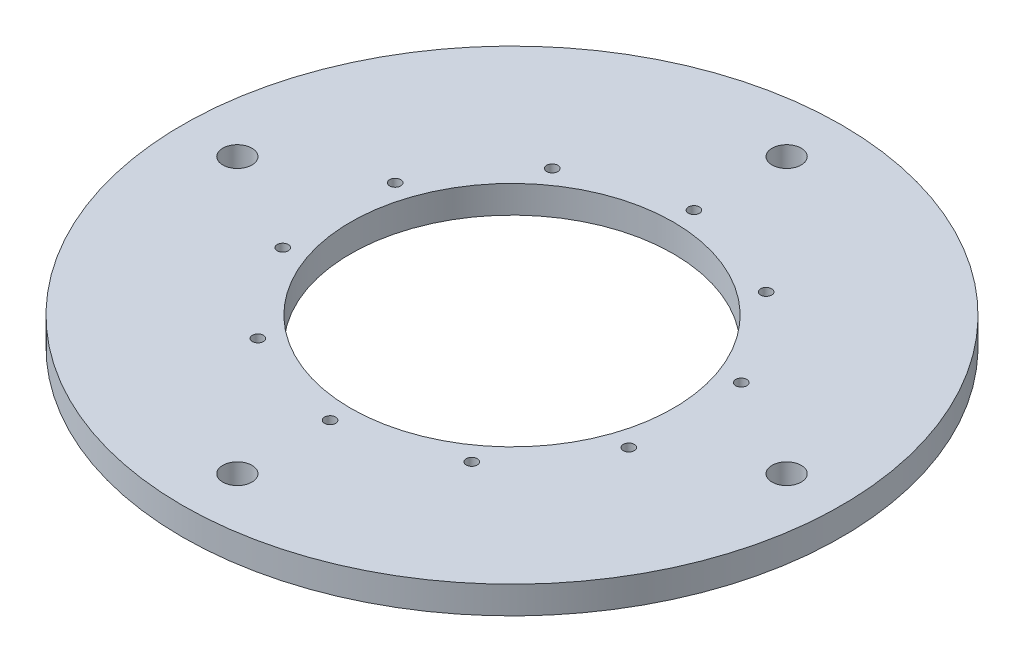
ISO-10303-21;
HEADER;
FILE_DESCRIPTION(('STEP AP214'),'2;1');
FILE_NAME('part.step','',(''),(''),'','','');
FILE_SCHEMA(('AUTOMOTIVE_DESIGN { 1 0 10303 214 1 1 1 1 }'));
ENDSEC;
DATA;
#1=APPLICATION_CONTEXT('core data for automotive mechanical design processes');
#2=APPLICATION_PROTOCOL_DEFINITION('international standard','automotive_design',2000,#1);
#3=PRODUCT_CONTEXT('',#1,'mechanical');
#4=PRODUCT('Part','Part','',(#3));
#5=PRODUCT_RELATED_PRODUCT_CATEGORY('part','',(#4));
#6=PRODUCT_DEFINITION_FORMATION('','',#4);
#7=PRODUCT_DEFINITION_CONTEXT('part definition',#1,'design');
#8=PRODUCT_DEFINITION('design','',#6,#7);
#9=PRODUCT_DEFINITION_SHAPE('','',#8);
#10=(LENGTH_UNIT() NAMED_UNIT(*) SI_UNIT(.MILLI.,.METRE.));
#11=(NAMED_UNIT(*) PLANE_ANGLE_UNIT() SI_UNIT($,.RADIAN.));
#12=(NAMED_UNIT(*) SI_UNIT($,.STERADIAN.) SOLID_ANGLE_UNIT());
#13=UNCERTAINTY_MEASURE_WITH_UNIT(LENGTH_MEASURE(1.E-05),#10,'distance_accuracy_value','');
#14=(GEOMETRIC_REPRESENTATION_CONTEXT(3) GLOBAL_UNCERTAINTY_ASSIGNED_CONTEXT((#13)) GLOBAL_UNIT_ASSIGNED_CONTEXT((#10,
#11,#12)) REPRESENTATION_CONTEXT('',''));
#15=CARTESIAN_POINT('',(0.,0.,0.));
#16=DIRECTION('',(0.,0.,1.));
#17=DIRECTION('',(1.,0.,0.));
#18=AXIS2_PLACEMENT_3D('',#15,#16,#17);
#19=CARTESIAN_POINT('',(0.,-12.7,0.));
#20=DIRECTION('',(0.,1.,0.));
#21=DIRECTION('',(0.,0.,1.));
#22=AXIS2_PLACEMENT_3D('',#19,#20,#21);
#23=CYLINDRICAL_SURFACE('',#22,74.6125);
#24=CARTESIAN_POINT('',(0.,-12.7,0.));
#25=DIRECTION('',(0.,1.,0.));
#26=DIRECTION('',(0.,0.,1.));
#27=AXIS2_PLACEMENT_3D('',#24,#25,#26);
#28=CIRCLE('',#27,74.6125);
#29=CARTESIAN_POINT('',(0.,-12.7,74.6125));
#30=VERTEX_POINT('',#29);
#31=EDGE_CURVE('E48',#30,#30,#28,.T.);
#32=ORIENTED_EDGE('',*,*,#31,.F.);
#33=EDGE_LOOP('',(#32));
#34=FACE_BOUND('',#33,.T.);
#35=CARTESIAN_POINT('',(0.,0.,0.));
#36=DIRECTION('',(0.,1.,0.));
#37=DIRECTION('',(0.,0.,1.));
#38=AXIS2_PLACEMENT_3D('',#35,#36,#37);
#39=CIRCLE('',#38,74.6125);
#40=CARTESIAN_POINT('',(0.,0.,74.6125));
#41=VERTEX_POINT('',#40);
#42=EDGE_CURVE('E55',#41,#41,#39,.T.);
#43=ORIENTED_EDGE('',*,*,#42,.T.);
#44=EDGE_LOOP('',(#43));
#45=FACE_BOUND('',#44,.T.);
#46=ADVANCED_FACE('F41',(#34,#45),#23,.F.);
#47=CARTESIAN_POINT('',(0.,-12.7,0.));
#48=DIRECTION('',(0.,1.,0.));
#49=DIRECTION('',(0.,0.,1.));
#50=AXIS2_PLACEMENT_3D('',#47,#48,#49);
#51=CYLINDRICAL_SURFACE('',#50,152.4);
#52=CARTESIAN_POINT('',(0.,-12.7,0.));
#53=DIRECTION('',(0.,1.,0.));
#54=DIRECTION('',(0.,0.,1.));
#55=AXIS2_PLACEMENT_3D('',#52,#53,#54);
#56=CIRCLE('',#55,152.4);
#57=CARTESIAN_POINT('',(0.,-12.7,152.4));
#58=VERTEX_POINT('',#57);
#59=EDGE_CURVE('E10',#58,#58,#56,.T.);
#60=ORIENTED_EDGE('',*,*,#59,.T.);
#61=EDGE_LOOP('',(#60));
#62=FACE_BOUND('',#61,.T.);
#63=CARTESIAN_POINT('',(0.,0.,0.));
#64=DIRECTION('',(0.,1.,0.));
#65=DIRECTION('',(0.,0.,1.));
#66=AXIS2_PLACEMENT_3D('',#63,#64,#65);
#67=CIRCLE('',#66,152.4);
#68=CARTESIAN_POINT('',(0.,0.,152.4));
#69=VERTEX_POINT('',#68);
#70=EDGE_CURVE('E44',#69,#69,#67,.T.);
#71=ORIENTED_EDGE('',*,*,#70,.F.);
#72=EDGE_LOOP('',(#71));
#73=FACE_BOUND('',#72,.T.);
#74=ADVANCED_FACE('F179',(#62,#73),#51,.T.);
#75=CARTESIAN_POINT('',(0.,-12.7,0.));
#76=DIRECTION('',(0.,1.,0.));
#77=DIRECTION('',(0.,0.,1.));
#78=AXIS2_PLACEMENT_3D('',#75,#76,#77);
#79=PLANE('',#78);
#80=CARTESIAN_POINT('',(-49.4547816647571,-12.7,-68.0686673642228));
#81=DIRECTION('',(0.,1.,0.));
#82=DIRECTION('',(0.587785252292462,0.,0.809016994374955));
#83=AXIS2_PLACEMENT_3D('',#80,#81,#82);
#84=CIRCLE('',#83,2.5527);
#85=CARTESIAN_POINT('',(-47.9543422512301,-12.7,-66.0034896826818));
#86=VERTEX_POINT('',#85);
#87=EDGE_CURVE('E103',#86,#86,#84,.T.);
#88=ORIENTED_EDGE('',*,*,#87,.T.);
#89=EDGE_LOOP('',(#88));
#90=FACE_BOUND('',#89,.T.);
#91=CARTESIAN_POINT('',(-80.0195176397832,-12.7,-25.999917364223));
#92=DIRECTION('',(0.,1.,0.));
#93=DIRECTION('',(0.95105651629515,0.,0.309016994374958));
#94=AXIS2_PLACEMENT_3D('',#91,#92,#93);
#95=CIRCLE('',#94,2.5527);
#96=CARTESIAN_POINT('',(-77.5917556706366,-12.7,-25.2110896826821));
#97=VERTEX_POINT('',#96);
#98=EDGE_CURVE('E102',#97,#97,#95,.T.);
#99=ORIENTED_EDGE('',*,*,#98,.T.);
#100=EDGE_LOOP('',(#99));
#101=FACE_BOUND('',#100,.T.);
#102=CARTESIAN_POINT('',(-80.0195176397837,-12.7,25.9999173642214));
#103=DIRECTION('',(0.,1.,0.));
#104=DIRECTION('',(0.951056516295157,0.,-0.309016994374938));
#105=AXIS2_PLACEMENT_3D('',#102,#103,#104);
#106=CIRCLE('',#105,2.5527);
#107=CARTESIAN_POINT('',(-77.5917556706371,-12.7,25.2110896826805));
#108=VERTEX_POINT('',#107);
#109=EDGE_CURVE('E109',#108,#108,#106,.T.);
#110=ORIENTED_EDGE('',*,*,#109,.T.);
#111=EDGE_LOOP('',(#110));
#112=FACE_BOUND('',#111,.T.);
#113=CARTESIAN_POINT('',(-49.4547816647586,-12.7,68.0686673642217));
#114=DIRECTION('',(0.,1.,0.));
#115=DIRECTION('',(0.58778525229248,0.,-0.809016994374942));
#116=AXIS2_PLACEMENT_3D('',#113,#114,#115);
#117=CIRCLE('',#116,2.5527);
#118=CARTESIAN_POINT('',(-47.9543422512315,-12.7,66.0034896826808));
#119=VERTEX_POINT('',#118);
#120=EDGE_CURVE('E115',#119,#119,#117,.T.);
#121=ORIENTED_EDGE('',*,*,#120,.T.);
#122=EDGE_LOOP('',(#121));
#123=FACE_BOUND('',#122,.T.);
#124=CARTESIAN_POINT('',(0.,-12.7,84.1375));
#125=DIRECTION('',(0.,1.,0.));
#126=DIRECTION('',(0.,0.,-1.));
#127=AXIS2_PLACEMENT_3D('',#124,#125,#126);
#128=CIRCLE('',#127,2.5527);
#129=CARTESIAN_POINT('',(0.,-12.7,81.5848));
#130=VERTEX_POINT('',#129);
#131=EDGE_CURVE('E121',#130,#130,#128,.T.);
#132=ORIENTED_EDGE('',*,*,#131,.T.);
#133=EDGE_LOOP('',(#132));
#134=FACE_BOUND('',#133,.T.);
#135=CARTESIAN_POINT('',(49.4547816647576,-12.7,68.0686673642224));
#136=DIRECTION('',(0.,1.,0.));
#137=DIRECTION('',(-0.587785252292469,0.,-0.809016994374951));
#138=AXIS2_PLACEMENT_3D('',#135,#136,#137);
#139=CIRCLE('',#138,2.5527);
#140=CARTESIAN_POINT('',(47.9543422512306,-12.7,66.0034896826815));
#141=VERTEX_POINT('',#140);
#142=EDGE_CURVE('E127',#141,#141,#139,.T.);
#143=ORIENTED_EDGE('',*,*,#142,.T.);
#144=EDGE_LOOP('',(#143));
#145=FACE_BOUND('',#144,.T.);
#146=CARTESIAN_POINT('',(80.0195176397834,-12.7,25.9999173642225));
#147=DIRECTION('',(0.,1.,0.));
#148=DIRECTION('',(-0.951056516295152,0.,-0.309016994374952));
#149=AXIS2_PLACEMENT_3D('',#146,#147,#148);
#150=CIRCLE('',#149,2.5527);
#151=CARTESIAN_POINT('',(77.5917556706368,-12.7,25.2110896826816));
#152=VERTEX_POINT('',#151);
#153=EDGE_CURVE('E133',#152,#152,#150,.T.);
#154=ORIENTED_EDGE('',*,*,#153,.T.);
#155=EDGE_LOOP('',(#154));
#156=FACE_BOUND('',#155,.T.);
#157=CARTESIAN_POINT('',(80.0195176397836,-12.7,-25.9999173642219));
#158=DIRECTION('',(0.,1.,0.));
#159=DIRECTION('',(-0.951056516295155,0.,0.309016994374945));
#160=AXIS2_PLACEMENT_3D('',#157,#158,#159);
#161=CIRCLE('',#160,2.5527);
#162=CARTESIAN_POINT('',(77.5917556706369,-12.7,-25.211089682681));
#163=VERTEX_POINT('',#162);
#164=EDGE_CURVE('E139',#163,#163,#161,.T.);
#165=ORIENTED_EDGE('',*,*,#164,.T.);
#166=EDGE_LOOP('',(#165));
#167=FACE_BOUND('',#166,.T.);
#168=CARTESIAN_POINT('',(49.4547816647581,-12.7,-68.0686673642221));
#169=DIRECTION('',(0.,1.,0.));
#170=DIRECTION('',(-0.587785252292474,0.,0.809016994374947));
#171=AXIS2_PLACEMENT_3D('',#168,#169,#170);
#172=CIRCLE('',#171,2.5527);
#173=CARTESIAN_POINT('',(47.9543422512311,-12.7,-66.0034896826812));
#174=VERTEX_POINT('',#173);
#175=EDGE_CURVE('E95',#174,#174,#172,.T.);
#176=ORIENTED_EDGE('',*,*,#175,.T.);
#177=EDGE_LOOP('',(#176));
#178=FACE_BOUND('',#177,.T.);
#179=CARTESIAN_POINT('',(0.,-12.7,-84.1375));
#180=DIRECTION('',(0.,1.,0.));
#181=DIRECTION('',(0.,0.,1.));
#182=AXIS2_PLACEMENT_3D('',#179,#180,#181);
#183=CIRCLE('',#182,2.5527);
#184=CARTESIAN_POINT('',(0.,-12.7,-81.5848));
#185=VERTEX_POINT('',#184);
#186=EDGE_CURVE('E76',#185,#185,#183,.T.);
#187=ORIENTED_EDGE('',*,*,#186,.T.);
#188=EDGE_LOOP('',(#187));
#189=FACE_BOUND('',#188,.T.);
#190=CARTESIAN_POINT('',(127.,-12.7,4.43418130033078E-13));
#191=DIRECTION('',(0.,1.,0.));
#192=DIRECTION('',(-1.,0.,0.));
#193=AXIS2_PLACEMENT_3D('',#190,#191,#192);
#194=CIRCLE('',#193,6.74624);
#195=CARTESIAN_POINT('',(120.25376,-12.7,4.19863758965721E-13));
#196=VERTEX_POINT('',#195);
#197=EDGE_CURVE('E80',#196,#196,#194,.T.);
#198=ORIENTED_EDGE('',*,*,#197,.T.);
#199=EDGE_LOOP('',(#198));
#200=FACE_BOUND('',#199,.T.);
#201=CARTESIAN_POINT('',(0.,-12.7,127.));
#202=DIRECTION('',(0.,1.,0.));
#203=DIRECTION('',(0.,0.,-1.));
#204=AXIS2_PLACEMENT_3D('',#201,#202,#203);
#205=CIRCLE('',#204,6.74624);
#206=CARTESIAN_POINT('',(0.,-12.7,120.25376));
#207=VERTEX_POINT('',#206);
#208=EDGE_CURVE('E72',#207,#207,#205,.T.);
#209=ORIENTED_EDGE('',*,*,#208,.T.);
#210=EDGE_LOOP('',(#209));
#211=FACE_BOUND('',#210,.T.);
#212=CARTESIAN_POINT('',(-127.,-12.7,-1.33025439009923E-12));
#213=DIRECTION('',(0.,1.,0.));
#214=DIRECTION('',(1.,0.,0.));
#215=AXIS2_PLACEMENT_3D('',#212,#213,#214);
#216=CIRCLE('',#215,6.74624);
#217=CARTESIAN_POINT('',(-120.25376,-12.7,-1.25959127689716E-12));
#218=VERTEX_POINT('',#217);
#219=EDGE_CURVE('E73',#218,#218,#216,.T.);
#220=ORIENTED_EDGE('',*,*,#219,.T.);
#221=EDGE_LOOP('',(#220));
#222=FACE_BOUND('',#221,.T.);
#223=CARTESIAN_POINT('',(0.,-12.7,-127.));
#224=DIRECTION('',(0.,1.,0.));
#225=DIRECTION('',(0.,0.,1.));
#226=AXIS2_PLACEMENT_3D('',#223,#224,#225);
#227=CIRCLE('',#226,6.74624);
#228=CARTESIAN_POINT('',(0.,-12.7,-120.25376));
#229=VERTEX_POINT('',#228);
#230=EDGE_CURVE('E57',#229,#229,#227,.T.);
#231=ORIENTED_EDGE('',*,*,#230,.T.);
#232=EDGE_LOOP('',(#231));
#233=FACE_BOUND('',#232,.T.);
#234=ORIENTED_EDGE('',*,*,#31,.T.);
#235=EDGE_LOOP('',(#234));
#236=FACE_BOUND('',#235,.T.);
#237=ORIENTED_EDGE('',*,*,#59,.F.);
#238=EDGE_LOOP('',(#237));
#239=FACE_BOUND('',#238,.T.);
#240=ADVANCED_FACE('F147',(#90,#101,#112,#123,#134,#145,#156,#167,#178,#189,#200,#211,#222,#233,
#236,#239),#79,.F.);
#241=CARTESIAN_POINT('',(0.,0.,0.));
#242=DIRECTION('',(0.,1.,0.));
#243=DIRECTION('',(0.,0.,1.));
#244=AXIS2_PLACEMENT_3D('',#241,#242,#243);
#245=PLANE('',#244);
#246=CARTESIAN_POINT('',(-49.4547816647571,0.,-68.0686673642228));
#247=DIRECTION('',(0.,1.,0.));
#248=DIRECTION('',(0.587785252292462,0.,0.809016994374955));
#249=AXIS2_PLACEMENT_3D('',#246,#247,#248);
#250=CIRCLE('',#249,2.5527);
#251=CARTESIAN_POINT('',(-47.9543422512301,0.,-66.0034896826818));
#252=VERTEX_POINT('',#251);
#253=EDGE_CURVE('E99',#252,#252,#250,.T.);
#254=ORIENTED_EDGE('',*,*,#253,.F.);
#255=EDGE_LOOP('',(#254));
#256=FACE_BOUND('',#255,.T.);
#257=CARTESIAN_POINT('',(-80.0195176397832,0.,-25.999917364223));
#258=DIRECTION('',(0.,1.,0.));
#259=DIRECTION('',(0.95105651629515,0.,0.309016994374958));
#260=AXIS2_PLACEMENT_3D('',#257,#258,#259);
#261=CIRCLE('',#260,2.5527);
#262=CARTESIAN_POINT('',(-77.5917556706366,0.,-25.2110896826821));
#263=VERTEX_POINT('',#262);
#264=EDGE_CURVE('E106',#263,#263,#261,.T.);
#265=ORIENTED_EDGE('',*,*,#264,.F.);
#266=EDGE_LOOP('',(#265));
#267=FACE_BOUND('',#266,.T.);
#268=CARTESIAN_POINT('',(-80.0195176397837,0.,25.9999173642214));
#269=DIRECTION('',(0.,1.,0.));
#270=DIRECTION('',(0.951056516295157,0.,-0.309016994374938));
#271=AXIS2_PLACEMENT_3D('',#268,#269,#270);
#272=CIRCLE('',#271,2.5527);
#273=CARTESIAN_POINT('',(-77.5917556706371,0.,25.2110896826805));
#274=VERTEX_POINT('',#273);
#275=EDGE_CURVE('E112',#274,#274,#272,.T.);
#276=ORIENTED_EDGE('',*,*,#275,.F.);
#277=EDGE_LOOP('',(#276));
#278=FACE_BOUND('',#277,.T.);
#279=CARTESIAN_POINT('',(-49.4547816647586,0.,68.0686673642217));
#280=DIRECTION('',(0.,1.,0.));
#281=DIRECTION('',(0.58778525229248,0.,-0.809016994374942));
#282=AXIS2_PLACEMENT_3D('',#279,#280,#281);
#283=CIRCLE('',#282,2.5527);
#284=CARTESIAN_POINT('',(-47.9543422512315,0.,66.0034896826808));
#285=VERTEX_POINT('',#284);
#286=EDGE_CURVE('E118',#285,#285,#283,.T.);
#287=ORIENTED_EDGE('',*,*,#286,.F.);
#288=EDGE_LOOP('',(#287));
#289=FACE_BOUND('',#288,.T.);
#290=CARTESIAN_POINT('',(0.,0.,84.1375));
#291=DIRECTION('',(0.,1.,0.));
#292=DIRECTION('',(0.,0.,-1.));
#293=AXIS2_PLACEMENT_3D('',#290,#291,#292);
#294=CIRCLE('',#293,2.5527);
#295=CARTESIAN_POINT('',(0.,0.,81.5848));
#296=VERTEX_POINT('',#295);
#297=EDGE_CURVE('E124',#296,#296,#294,.T.);
#298=ORIENTED_EDGE('',*,*,#297,.F.);
#299=EDGE_LOOP('',(#298));
#300=FACE_BOUND('',#299,.T.);
#301=CARTESIAN_POINT('',(49.4547816647576,0.,68.0686673642224));
#302=DIRECTION('',(0.,1.,0.));
#303=DIRECTION('',(-0.587785252292469,0.,-0.809016994374951));
#304=AXIS2_PLACEMENT_3D('',#301,#302,#303);
#305=CIRCLE('',#304,2.5527);
#306=CARTESIAN_POINT('',(47.9543422512306,0.,66.0034896826815));
#307=VERTEX_POINT('',#306);
#308=EDGE_CURVE('E130',#307,#307,#305,.T.);
#309=ORIENTED_EDGE('',*,*,#308,.F.);
#310=EDGE_LOOP('',(#309));
#311=FACE_BOUND('',#310,.T.);
#312=CARTESIAN_POINT('',(80.0195176397834,0.,25.9999173642225));
#313=DIRECTION('',(0.,1.,0.));
#314=DIRECTION('',(-0.951056516295152,0.,-0.309016994374952));
#315=AXIS2_PLACEMENT_3D('',#312,#313,#314);
#316=CIRCLE('',#315,2.5527);
#317=CARTESIAN_POINT('',(77.5917556706368,0.,25.2110896826816));
#318=VERTEX_POINT('',#317);
#319=EDGE_CURVE('E136',#318,#318,#316,.T.);
#320=ORIENTED_EDGE('',*,*,#319,.F.);
#321=EDGE_LOOP('',(#320));
#322=FACE_BOUND('',#321,.T.);
#323=CARTESIAN_POINT('',(80.0195176397836,0.,-25.9999173642219));
#324=DIRECTION('',(0.,1.,0.));
#325=DIRECTION('',(-0.951056516295155,0.,0.309016994374945));
#326=AXIS2_PLACEMENT_3D('',#323,#324,#325);
#327=CIRCLE('',#326,2.5527);
#328=CARTESIAN_POINT('',(77.5917556706369,0.,-25.211089682681));
#329=VERTEX_POINT('',#328);
#330=EDGE_CURVE('E98',#329,#329,#327,.T.);
#331=ORIENTED_EDGE('',*,*,#330,.F.);
#332=EDGE_LOOP('',(#331));
#333=FACE_BOUND('',#332,.T.);
#334=CARTESIAN_POINT('',(49.4547816647581,0.,-68.0686673642221));
#335=DIRECTION('',(0.,1.,0.));
#336=DIRECTION('',(-0.587785252292474,0.,0.809016994374947));
#337=AXIS2_PLACEMENT_3D('',#334,#335,#336);
#338=CIRCLE('',#337,2.5527);
#339=CARTESIAN_POINT('',(47.9543422512311,0.,-66.0034896826812));
#340=VERTEX_POINT('',#339);
#341=EDGE_CURVE('E92',#340,#340,#338,.T.);
#342=ORIENTED_EDGE('',*,*,#341,.F.);
#343=EDGE_LOOP('',(#342));
#344=FACE_BOUND('',#343,.T.);
#345=CARTESIAN_POINT('',(0.,0.,-84.1375));
#346=DIRECTION('',(0.,1.,0.));
#347=DIRECTION('',(0.,0.,1.));
#348=AXIS2_PLACEMENT_3D('',#345,#346,#347);
#349=CIRCLE('',#348,2.5527);
#350=CARTESIAN_POINT('',(0.,0.,-81.5848));
#351=VERTEX_POINT('',#350);
#352=EDGE_CURVE('E89',#351,#351,#349,.T.);
#353=ORIENTED_EDGE('',*,*,#352,.F.);
#354=EDGE_LOOP('',(#353));
#355=FACE_BOUND('',#354,.T.);
#356=CARTESIAN_POINT('',(127.,0.,4.43418130033078E-13));
#357=DIRECTION('',(0.,1.,0.));
#358=DIRECTION('',(-1.,0.,0.));
#359=AXIS2_PLACEMENT_3D('',#356,#357,#358);
#360=CIRCLE('',#359,6.74624);
#361=CARTESIAN_POINT('',(120.25376,0.,4.19863758965721E-13));
#362=VERTEX_POINT('',#361);
#363=EDGE_CURVE('E66',#362,#362,#360,.T.);
#364=ORIENTED_EDGE('',*,*,#363,.F.);
#365=EDGE_LOOP('',(#364));
#366=FACE_BOUND('',#365,.T.);
#367=CARTESIAN_POINT('',(0.,0.,127.));
#368=DIRECTION('',(0.,1.,0.));
#369=DIRECTION('',(0.,0.,-1.));
#370=AXIS2_PLACEMENT_3D('',#367,#368,#369);
#371=CIRCLE('',#370,6.74624);
#372=CARTESIAN_POINT('',(0.,0.,120.25376));
#373=VERTEX_POINT('',#372);
#374=EDGE_CURVE('E77',#373,#373,#371,.T.);
#375=ORIENTED_EDGE('',*,*,#374,.F.);
#376=EDGE_LOOP('',(#375));
#377=FACE_BOUND('',#376,.T.);
#378=CARTESIAN_POINT('',(-127.,0.,-1.33025439009923E-12));
#379=DIRECTION('',(0.,1.,0.));
#380=DIRECTION('',(1.,0.,0.));
#381=AXIS2_PLACEMENT_3D('',#378,#379,#380);
#382=CIRCLE('',#381,6.74624);
#383=CARTESIAN_POINT('',(-120.25376,0.,-1.25959127689716E-12));
#384=VERTEX_POINT('',#383);
#385=EDGE_CURVE('E69',#384,#384,#382,.T.);
#386=ORIENTED_EDGE('',*,*,#385,.F.);
#387=EDGE_LOOP('',(#386));
#388=FACE_BOUND('',#387,.T.);
#389=CARTESIAN_POINT('',(0.,0.,-127.));
#390=DIRECTION('',(0.,1.,0.));
#391=DIRECTION('',(0.,0.,1.));
#392=AXIS2_PLACEMENT_3D('',#389,#390,#391);
#393=CIRCLE('',#392,6.74624);
#394=CARTESIAN_POINT('',(0.,0.,-120.25376));
#395=VERTEX_POINT('',#394);
#396=EDGE_CURVE('E62',#395,#395,#393,.T.);
#397=ORIENTED_EDGE('',*,*,#396,.F.);
#398=EDGE_LOOP('',(#397));
#399=FACE_BOUND('',#398,.T.);
#400=ORIENTED_EDGE('',*,*,#42,.F.);
#401=EDGE_LOOP('',(#400));
#402=FACE_BOUND('',#401,.T.);
#403=ORIENTED_EDGE('',*,*,#70,.T.);
#404=EDGE_LOOP('',(#403));
#405=FACE_BOUND('',#404,.T.);
#406=ADVANCED_FACE('F158',(#256,#267,#278,#289,#300,#311,#322,#333,#344,#355,#366,#377,#388,
#399,#402,#405),#245,.T.);
#407=CARTESIAN_POINT('',(0.,0.,-127.));
#408=DIRECTION('',(0.,1.,0.));
#409=DIRECTION('',(0.,0.,1.));
#410=AXIS2_PLACEMENT_3D('',#407,#408,#409);
#411=CYLINDRICAL_SURFACE('',#410,6.74624);
#412=ORIENTED_EDGE('',*,*,#230,.F.);
#413=EDGE_LOOP('',(#412));
#414=FACE_BOUND('',#413,.T.);
#415=ORIENTED_EDGE('',*,*,#396,.T.);
#416=EDGE_LOOP('',(#415));
#417=FACE_BOUND('',#416,.T.);
#418=ADVANCED_FACE('F161',(#414,#417),#411,.F.);
#419=CARTESIAN_POINT('',(-127.,0.,-1.33025439009923E-12));
#420=DIRECTION('',(0.,1.,0.));
#421=DIRECTION('',(1.,0.,0.));
#422=AXIS2_PLACEMENT_3D('',#419,#420,#421);
#423=CYLINDRICAL_SURFACE('',#422,6.74624);
#424=ORIENTED_EDGE('',*,*,#219,.F.);
#425=EDGE_LOOP('',(#424));
#426=FACE_BOUND('',#425,.T.);
#427=ORIENTED_EDGE('',*,*,#385,.T.);
#428=EDGE_LOOP('',(#427));
#429=FACE_BOUND('',#428,.T.);
#430=ADVANCED_FACE('F191',(#426,#429),#423,.F.);
#431=CARTESIAN_POINT('',(0.,0.,127.));
#432=DIRECTION('',(0.,1.,0.));
#433=DIRECTION('',(0.,0.,-1.));
#434=AXIS2_PLACEMENT_3D('',#431,#432,#433);
#435=CYLINDRICAL_SURFACE('',#434,6.74624);
#436=ORIENTED_EDGE('',*,*,#208,.F.);
#437=EDGE_LOOP('',(#436));
#438=FACE_BOUND('',#437,.T.);
#439=ORIENTED_EDGE('',*,*,#374,.T.);
#440=EDGE_LOOP('',(#439));
#441=FACE_BOUND('',#440,.T.);
#442=ADVANCED_FACE('F195',(#438,#441),#435,.F.);
#443=CARTESIAN_POINT('',(127.,0.,4.43418130033078E-13));
#444=DIRECTION('',(0.,1.,0.));
#445=DIRECTION('',(-1.,0.,0.));
#446=AXIS2_PLACEMENT_3D('',#443,#444,#445);
#447=CYLINDRICAL_SURFACE('',#446,6.74624);
#448=ORIENTED_EDGE('',*,*,#197,.F.);
#449=EDGE_LOOP('',(#448));
#450=FACE_BOUND('',#449,.T.);
#451=ORIENTED_EDGE('',*,*,#363,.T.);
#452=EDGE_LOOP('',(#451));
#453=FACE_BOUND('',#452,.T.);
#454=ADVANCED_FACE('F199',(#450,#453),#447,.F.);
#455=CARTESIAN_POINT('',(0.,0.,-84.1375));
#456=DIRECTION('',(0.,1.,0.));
#457=DIRECTION('',(0.,0.,1.));
#458=AXIS2_PLACEMENT_3D('',#455,#456,#457);
#459=CYLINDRICAL_SURFACE('',#458,2.5527);
#460=ORIENTED_EDGE('',*,*,#186,.F.);
#461=EDGE_LOOP('',(#460));
#462=FACE_BOUND('',#461,.T.);
#463=ORIENTED_EDGE('',*,*,#352,.T.);
#464=EDGE_LOOP('',(#463));
#465=FACE_BOUND('',#464,.T.);
#466=ADVANCED_FACE('F203',(#462,#465),#459,.F.);
#467=CARTESIAN_POINT('',(49.4547816647581,0.,-68.0686673642221));
#468=DIRECTION('',(0.,1.,0.));
#469=DIRECTION('',(-0.587785252292474,0.,0.809016994374947));
#470=AXIS2_PLACEMENT_3D('',#467,#468,#469);
#471=CYLINDRICAL_SURFACE('',#470,2.5527);
#472=ORIENTED_EDGE('',*,*,#175,.F.);
#473=EDGE_LOOP('',(#472));
#474=FACE_BOUND('',#473,.T.);
#475=ORIENTED_EDGE('',*,*,#341,.T.);
#476=EDGE_LOOP('',(#475));
#477=FACE_BOUND('',#476,.T.);
#478=ADVANCED_FACE('F154',(#474,#477),#471,.F.);
#479=CARTESIAN_POINT('',(80.0195176397836,0.,-25.9999173642219));
#480=DIRECTION('',(0.,1.,0.));
#481=DIRECTION('',(-0.951056516295155,0.,0.309016994374945));
#482=AXIS2_PLACEMENT_3D('',#479,#480,#481);
#483=CYLINDRICAL_SURFACE('',#482,2.5527);
#484=ORIENTED_EDGE('',*,*,#164,.F.);
#485=EDGE_LOOP('',(#484));
#486=FACE_BOUND('',#485,.T.);
#487=ORIENTED_EDGE('',*,*,#330,.T.);
#488=EDGE_LOOP('',(#487));
#489=FACE_BOUND('',#488,.T.);
#490=ADVANCED_FACE('F150',(#486,#489),#483,.F.);
#491=CARTESIAN_POINT('',(80.0195176397834,0.,25.9999173642225));
#492=DIRECTION('',(0.,1.,0.));
#493=DIRECTION('',(-0.951056516295152,0.,-0.309016994374952));
#494=AXIS2_PLACEMENT_3D('',#491,#492,#493);
#495=CYLINDRICAL_SURFACE('',#494,2.5527);
#496=ORIENTED_EDGE('',*,*,#153,.F.);
#497=EDGE_LOOP('',(#496));
#498=FACE_BOUND('',#497,.T.);
#499=ORIENTED_EDGE('',*,*,#319,.T.);
#500=EDGE_LOOP('',(#499));
#501=FACE_BOUND('',#500,.T.);
#502=ADVANCED_FACE('F153',(#498,#501),#495,.F.);
#503=CARTESIAN_POINT('',(49.4547816647576,0.,68.0686673642224));
#504=DIRECTION('',(0.,1.,0.));
#505=DIRECTION('',(-0.587785252292469,0.,-0.809016994374951));
#506=AXIS2_PLACEMENT_3D('',#503,#504,#505);
#507=CYLINDRICAL_SURFACE('',#506,2.5527);
#508=ORIENTED_EDGE('',*,*,#142,.F.);
#509=EDGE_LOOP('',(#508));
#510=FACE_BOUND('',#509,.T.);
#511=ORIENTED_EDGE('',*,*,#308,.T.);
#512=EDGE_LOOP('',(#511));
#513=FACE_BOUND('',#512,.T.);
#514=ADVANCED_FACE('F230',(#510,#513),#507,.F.);
#515=CARTESIAN_POINT('',(0.,0.,84.1375));
#516=DIRECTION('',(0.,1.,0.));
#517=DIRECTION('',(0.,0.,-1.));
#518=AXIS2_PLACEMENT_3D('',#515,#516,#517);
#519=CYLINDRICAL_SURFACE('',#518,2.5527);
#520=ORIENTED_EDGE('',*,*,#131,.F.);
#521=EDGE_LOOP('',(#520));
#522=FACE_BOUND('',#521,.T.);
#523=ORIENTED_EDGE('',*,*,#297,.T.);
#524=EDGE_LOOP('',(#523));
#525=FACE_BOUND('',#524,.T.);
#526=ADVANCED_FACE('F226',(#522,#525),#519,.F.);
#527=CARTESIAN_POINT('',(-49.4547816647586,0.,68.0686673642217));
#528=DIRECTION('',(0.,1.,0.));
#529=DIRECTION('',(0.58778525229248,0.,-0.809016994374942));
#530=AXIS2_PLACEMENT_3D('',#527,#528,#529);
#531=CYLINDRICAL_SURFACE('',#530,2.5527);
#532=ORIENTED_EDGE('',*,*,#120,.F.);
#533=EDGE_LOOP('',(#532));
#534=FACE_BOUND('',#533,.T.);
#535=ORIENTED_EDGE('',*,*,#286,.T.);
#536=EDGE_LOOP('',(#535));
#537=FACE_BOUND('',#536,.T.);
#538=ADVANCED_FACE('F222',(#534,#537),#531,.F.);
#539=CARTESIAN_POINT('',(-80.0195176397837,0.,25.9999173642214));
#540=DIRECTION('',(0.,1.,0.));
#541=DIRECTION('',(0.951056516295157,0.,-0.309016994374938));
#542=AXIS2_PLACEMENT_3D('',#539,#540,#541);
#543=CYLINDRICAL_SURFACE('',#542,2.5527);
#544=ORIENTED_EDGE('',*,*,#109,.F.);
#545=EDGE_LOOP('',(#544));
#546=FACE_BOUND('',#545,.T.);
#547=ORIENTED_EDGE('',*,*,#275,.T.);
#548=EDGE_LOOP('',(#547));
#549=FACE_BOUND('',#548,.T.);
#550=ADVANCED_FACE('F218',(#546,#549),#543,.F.);
#551=CARTESIAN_POINT('',(-80.0195176397832,0.,-25.999917364223));
#552=DIRECTION('',(0.,1.,0.));
#553=DIRECTION('',(0.95105651629515,0.,0.309016994374958));
#554=AXIS2_PLACEMENT_3D('',#551,#552,#553);
#555=CYLINDRICAL_SURFACE('',#554,2.5527);
#556=ORIENTED_EDGE('',*,*,#98,.F.);
#557=EDGE_LOOP('',(#556));
#558=FACE_BOUND('',#557,.T.);
#559=ORIENTED_EDGE('',*,*,#264,.T.);
#560=EDGE_LOOP('',(#559));
#561=FACE_BOUND('',#560,.T.);
#562=ADVANCED_FACE('F214',(#558,#561),#555,.F.);
#563=CARTESIAN_POINT('',(-49.4547816647571,0.,-68.0686673642228));
#564=DIRECTION('',(0.,1.,0.));
#565=DIRECTION('',(0.587785252292462,0.,0.809016994374955));
#566=AXIS2_PLACEMENT_3D('',#563,#564,#565);
#567=CYLINDRICAL_SURFACE('',#566,2.5527);
#568=ORIENTED_EDGE('',*,*,#87,.F.);
#569=EDGE_LOOP('',(#568));
#570=FACE_BOUND('',#569,.T.);
#571=ORIENTED_EDGE('',*,*,#253,.T.);
#572=EDGE_LOOP('',(#571));
#573=FACE_BOUND('',#572,.T.);
#574=ADVANCED_FACE('F211',(#570,#573),#567,.F.);
#575=CLOSED_SHELL('',(#46,#74,#240,#406,#418,#430,#442,#454,#466,#478,#490,#502,#514,#526,#538,
#550,#562,#574));
#576=MANIFOLD_SOLID_BREP('B2',#575);
#577=ADVANCED_BREP_SHAPE_REPRESENTATION('',(#18,#576),#14);
#578=SHAPE_DEFINITION_REPRESENTATION(#9,#577);
ENDSEC;
END-ISO-10303-21;
